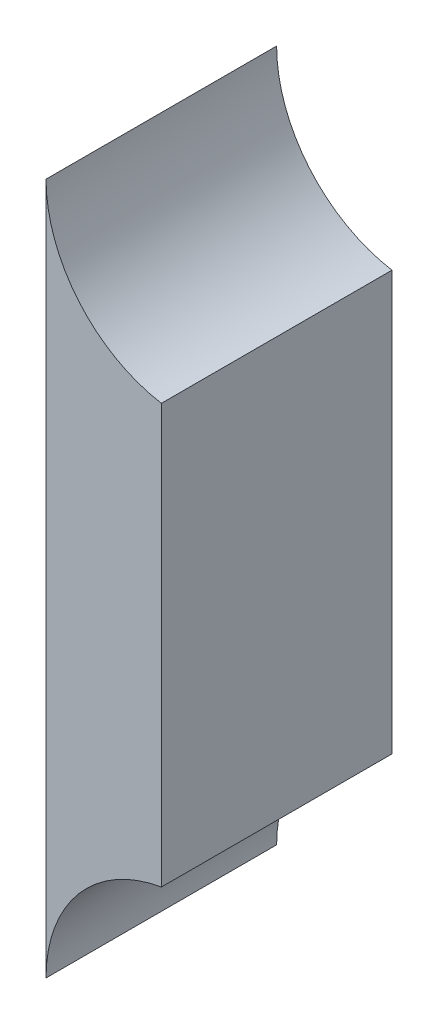
ISO-10303-21;
HEADER;
FILE_DESCRIPTION(('STEP AP214'),'2;1');
FILE_NAME('part.step','',(''),(''),'','','');
FILE_SCHEMA(('AUTOMOTIVE_DESIGN { 1 0 10303 214 1 1 1 1 }'));
ENDSEC;
DATA;
#1=APPLICATION_CONTEXT('core data for automotive mechanical design processes');
#2=APPLICATION_PROTOCOL_DEFINITION('international standard','automotive_design',2000,#1);
#3=PRODUCT_CONTEXT('',#1,'mechanical');
#4=PRODUCT('Part','Part','',(#3));
#5=PRODUCT_RELATED_PRODUCT_CATEGORY('part','',(#4));
#6=PRODUCT_DEFINITION_FORMATION('','',#4);
#7=PRODUCT_DEFINITION_CONTEXT('part definition',#1,'design');
#8=PRODUCT_DEFINITION('design','',#6,#7);
#9=PRODUCT_DEFINITION_SHAPE('','',#8);
#10=(LENGTH_UNIT() NAMED_UNIT(*) SI_UNIT(.MILLI.,.METRE.));
#11=(NAMED_UNIT(*) PLANE_ANGLE_UNIT() SI_UNIT($,.RADIAN.));
#12=(NAMED_UNIT(*) SI_UNIT($,.STERADIAN.) SOLID_ANGLE_UNIT());
#13=UNCERTAINTY_MEASURE_WITH_UNIT(LENGTH_MEASURE(1.E-05),#10,'distance_accuracy_value','');
#14=(GEOMETRIC_REPRESENTATION_CONTEXT(3) GLOBAL_UNCERTAINTY_ASSIGNED_CONTEXT((#13)) GLOBAL_UNIT_ASSIGNED_CONTEXT((#10,
#11,#12)) REPRESENTATION_CONTEXT('',''));
#15=CARTESIAN_POINT('',(0.,0.,0.));
#16=DIRECTION('',(0.,0.,1.));
#17=DIRECTION('',(1.,0.,0.));
#18=AXIS2_PLACEMENT_3D('',#15,#16,#17);
#19=CARTESIAN_POINT('',(35.1549999999999,16.7786796569386,0.5));
#20=DIRECTION('',(0.,0.,-1.));
#21=DIRECTION('',(-1.,0.,0.));
#22=AXIS2_PLACEMENT_3D('',#19,#20,#21);
#23=CYLINDRICAL_SURFACE('',#22,0.300000000000245);
#24=CARTESIAN_POINT('',(35.1549999999999,16.7786796569386,0.));
#25=DIRECTION('',(0.,0.,1.));
#26=DIRECTION('',(1.,0.,0.));
#27=AXIS2_PLACEMENT_3D('',#24,#25,#26);
#28=CIRCLE('',#27,0.300000000000245);
#29=CARTESIAN_POINT('',(34.8549999999998,16.7786796569385,0.));
#30=VERTEX_POINT('',#29);
#31=CARTESIAN_POINT('',(35.1051454293305,16.4828511225077,0.));
#32=VERTEX_POINT('',#31);
#33=EDGE_CURVE('E11',#30,#32,#28,.T.);
#34=ORIENTED_EDGE('',*,*,#33,.F.);
#35=DIRECTION('',(0.,0.,-1.));
#36=VECTOR('',#35,1.);
#37=CARTESIAN_POINT('',(34.8549999999998,16.7786796569385,0.5));
#38=LINE('',#37,#36);
#39=CARTESIAN_POINT('',(34.8549999999998,16.7786796569385,0.5));
#40=VERTEX_POINT('',#39);
#41=EDGE_CURVE('E24',#40,#30,#38,.T.);
#42=ORIENTED_EDGE('',*,*,#41,.F.);
#43=CARTESIAN_POINT('',(35.1549999999999,16.7786796569386,0.5));
#44=DIRECTION('',(0.,0.,1.));
#45=DIRECTION('',(1.,0.,0.));
#46=AXIS2_PLACEMENT_3D('',#43,#44,#45);
#47=CIRCLE('',#46,0.300000000000245);
#48=CARTESIAN_POINT('',(35.1051454293305,16.4828511225077,0.5));
#49=VERTEX_POINT('',#48);
#50=EDGE_CURVE('E87',#40,#49,#47,.T.);
#51=ORIENTED_EDGE('',*,*,#50,.T.);
#52=DIRECTION('',(0.,0.,-1.));
#53=VECTOR('',#52,1.);
#54=CARTESIAN_POINT('',(35.1051454293305,16.4828511225077,0.5));
#55=LINE('',#54,#53);
#56=EDGE_CURVE('E37',#49,#32,#55,.T.);
#57=ORIENTED_EDGE('',*,*,#56,.T.);
#58=EDGE_LOOP('',(#34,#42,#51,#57));
#59=FACE_BOUND('',#58,.T.);
#60=ADVANCED_FACE('F17',(#59),#23,.F.);
#61=CARTESIAN_POINT('',(34.8550000000035,7.7393647020936E-12,0.5));
#62=DIRECTION('',(1.,2.22044604851322E-13,0.));
#63=DIRECTION('',(-2.22044604851322E-13,1.,0.));
#64=AXIS2_PLACEMENT_3D('',#61,#62,#63);
#65=PLANE('',#64);
#66=DIRECTION('',(2.22044604851322E-13,-1.,0.));
#67=VECTOR('',#66,1.);
#68=CARTESIAN_POINT('',(34.8550000000035,7.7393647020936E-12,0.));
#69=LINE('',#68,#67);
#70=CARTESIAN_POINT('',(34.8550000000001,15.2786796564406,0.));
#71=VERTEX_POINT('',#70);
#72=EDGE_CURVE('E84',#30,#71,#69,.T.);
#73=ORIENTED_EDGE('',*,*,#72,.T.);
#74=DIRECTION('',(0.,0.,-1.));
#75=VECTOR('',#74,1.);
#76=CARTESIAN_POINT('',(34.8550000000001,15.2786796564406,0.5));
#77=LINE('',#76,#75);
#78=CARTESIAN_POINT('',(34.8550000000001,15.2786796564406,0.5));
#79=VERTEX_POINT('',#78);
#80=EDGE_CURVE('E82',#79,#71,#77,.T.);
#81=ORIENTED_EDGE('',*,*,#80,.F.);
#82=DIRECTION('',(2.22044604851322E-13,-1.,0.));
#83=VECTOR('',#82,1.);
#84=CARTESIAN_POINT('',(34.8550000000035,7.7393647020936E-12,0.5));
#85=LINE('',#84,#83);
#86=EDGE_CURVE('E62',#40,#79,#85,.T.);
#87=ORIENTED_EDGE('',*,*,#86,.F.);
#88=ORIENTED_EDGE('',*,*,#41,.T.);
#89=EDGE_LOOP('',(#73,#81,#87,#88));
#90=FACE_BOUND('',#89,.T.);
#91=ADVANCED_FACE('F89',(#90),#65,.F.);
#92=CARTESIAN_POINT('',(35.1550000000001,15.2786796564406,0.5));
#93=DIRECTION('',(0.,0.,-1.));
#94=DIRECTION('',(-1.,0.,0.));
#95=AXIS2_PLACEMENT_3D('',#92,#93,#94);
#96=CYLINDRICAL_SURFACE('',#95,0.299999999999995);
#97=CARTESIAN_POINT('',(35.1550000000001,15.2786796564406,0.));
#98=DIRECTION('',(0.,0.,1.));
#99=DIRECTION('',(1.,0.,0.));
#100=AXIS2_PLACEMENT_3D('',#97,#98,#99);
#101=CIRCLE('',#100,0.299999999999995);
#102=CARTESIAN_POINT('',(35.1051454293305,15.5745081908712,0.));
#103=VERTEX_POINT('',#102);
#104=EDGE_CURVE('E71',#103,#71,#101,.T.);
#105=ORIENTED_EDGE('',*,*,#104,.F.);
#106=DIRECTION('',(0.,0.,-1.));
#107=VECTOR('',#106,1.);
#108=CARTESIAN_POINT('',(35.1051454293305,15.5745081908712,0.5));
#109=LINE('',#108,#107);
#110=CARTESIAN_POINT('',(35.1051454293305,15.5745081908712,0.5));
#111=VERTEX_POINT('',#110);
#112=EDGE_CURVE('E65',#111,#103,#109,.T.);
#113=ORIENTED_EDGE('',*,*,#112,.F.);
#114=CARTESIAN_POINT('',(35.1550000000001,15.2786796564406,0.5));
#115=DIRECTION('',(0.,0.,1.));
#116=DIRECTION('',(1.,0.,0.));
#117=AXIS2_PLACEMENT_3D('',#114,#115,#116);
#118=CIRCLE('',#117,0.299999999999995);
#119=EDGE_CURVE('E57',#111,#79,#118,.T.);
#120=ORIENTED_EDGE('',*,*,#119,.T.);
#121=ORIENTED_EDGE('',*,*,#80,.T.);
#122=EDGE_LOOP('',(#105,#113,#120,#121));
#123=FACE_BOUND('',#122,.T.);
#124=ADVANCED_FACE('F69',(#123),#96,.F.);
#125=CARTESIAN_POINT('',(35.1051454293305,0.,0.5));
#126=DIRECTION('',(1.,0.,0.));
#127=DIRECTION('',(0.,0.,-1.));
#128=AXIS2_PLACEMENT_3D('',#125,#126,#127);
#129=PLANE('',#128);
#130=DIRECTION('',(0.,-1.,0.));
#131=VECTOR('',#130,1.);
#132=CARTESIAN_POINT('',(35.1051454293305,0.,0.));
#133=LINE('',#132,#131);
#134=EDGE_CURVE('E66',#32,#103,#133,.T.);
#135=ORIENTED_EDGE('',*,*,#134,.F.);
#136=ORIENTED_EDGE('',*,*,#56,.F.);
#137=DIRECTION('',(0.,-1.,0.));
#138=VECTOR('',#137,1.);
#139=CARTESIAN_POINT('',(35.1051454293305,0.,0.5));
#140=LINE('',#139,#138);
#141=EDGE_CURVE('E61',#49,#111,#140,.T.);
#142=ORIENTED_EDGE('',*,*,#141,.T.);
#143=ORIENTED_EDGE('',*,*,#112,.T.);
#144=EDGE_LOOP('',(#135,#136,#142,#143));
#145=FACE_BOUND('',#144,.T.);
#146=ADVANCED_FACE('F76',(#145),#129,.T.);
#147=CARTESIAN_POINT('',(0.,0.,0.5));
#148=DIRECTION('',(0.,0.,1.));
#149=DIRECTION('',(1.,0.,0.));
#150=AXIS2_PLACEMENT_3D('',#147,#148,#149);
#151=PLANE('',#150);
#152=ORIENTED_EDGE('',*,*,#50,.F.);
#153=ORIENTED_EDGE('',*,*,#86,.T.);
#154=ORIENTED_EDGE('',*,*,#119,.F.);
#155=ORIENTED_EDGE('',*,*,#141,.F.);
#156=EDGE_LOOP('',(#152,#153,#154,#155));
#157=FACE_BOUND('',#156,.T.);
#158=ADVANCED_FACE('F59',(#157),#151,.T.);
#159=CARTESIAN_POINT('',(0.,0.,0.));
#160=DIRECTION('',(0.,0.,1.));
#161=DIRECTION('',(1.,0.,0.));
#162=AXIS2_PLACEMENT_3D('',#159,#160,#161);
#163=PLANE('',#162);
#164=ORIENTED_EDGE('',*,*,#33,.T.);
#165=ORIENTED_EDGE('',*,*,#134,.T.);
#166=ORIENTED_EDGE('',*,*,#104,.T.);
#167=ORIENTED_EDGE('',*,*,#72,.F.);
#168=EDGE_LOOP('',(#164,#165,#166,#167));
#169=FACE_BOUND('',#168,.T.);
#170=ADVANCED_FACE('F91',(#169),#163,.F.);
#171=CLOSED_SHELL('',(#60,#91,#124,#146,#158,#170));
#172=MANIFOLD_SOLID_BREP('B1',#171);
#173=ADVANCED_BREP_SHAPE_REPRESENTATION('',(#18,#172),#14);
#174=SHAPE_DEFINITION_REPRESENTATION(#9,#173);
ENDSEC;
END-ISO-10303-21;
